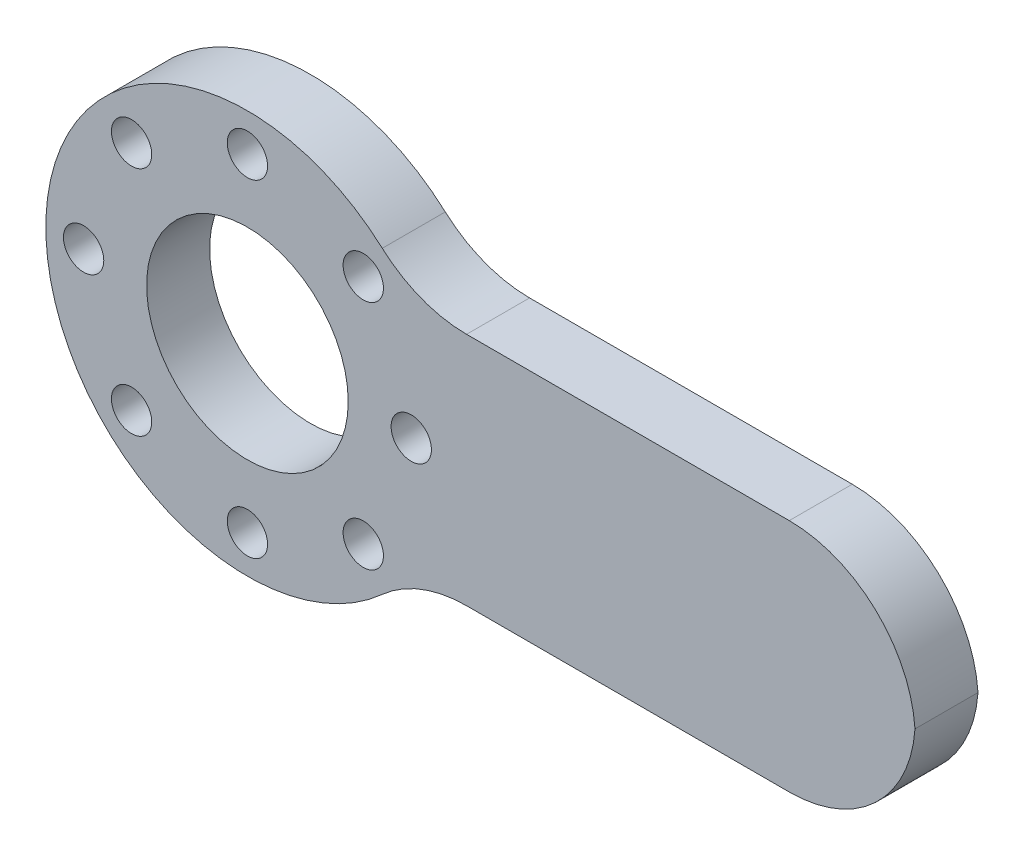
ISO-10303-21;
HEADER;
FILE_DESCRIPTION(('STEP AP214'),'2;1');
FILE_NAME('part.step','',(''),(''),'','','');
FILE_SCHEMA(('AUTOMOTIVE_DESIGN { 1 0 10303 214 1 1 1 1 }'));
ENDSEC;
DATA;
#1=APPLICATION_CONTEXT('core data for automotive mechanical design processes');
#2=APPLICATION_PROTOCOL_DEFINITION('international standard','automotive_design',2000,#1);
#3=PRODUCT_CONTEXT('',#1,'mechanical');
#4=PRODUCT('Part','Part','',(#3));
#5=PRODUCT_RELATED_PRODUCT_CATEGORY('part','',(#4));
#6=PRODUCT_DEFINITION_FORMATION('','',#4);
#7=PRODUCT_DEFINITION_CONTEXT('part definition',#1,'design');
#8=PRODUCT_DEFINITION('design','',#6,#7);
#9=PRODUCT_DEFINITION_SHAPE('','',#8);
#10=(LENGTH_UNIT() NAMED_UNIT(*) SI_UNIT(.MILLI.,.METRE.));
#11=(NAMED_UNIT(*) PLANE_ANGLE_UNIT() SI_UNIT($,.RADIAN.));
#12=(NAMED_UNIT(*) SI_UNIT($,.STERADIAN.) SOLID_ANGLE_UNIT());
#13=UNCERTAINTY_MEASURE_WITH_UNIT(LENGTH_MEASURE(1.E-05),#10,'distance_accuracy_value','');
#14=(GEOMETRIC_REPRESENTATION_CONTEXT(3) GLOBAL_UNCERTAINTY_ASSIGNED_CONTEXT((#13)) GLOBAL_UNIT_ASSIGNED_CONTEXT((#10,
#11,#12)) REPRESENTATION_CONTEXT('',''));
#15=CARTESIAN_POINT('',(0.,0.,0.));
#16=DIRECTION('',(0.,0.,1.));
#17=DIRECTION('',(1.,0.,0.));
#18=AXIS2_PLACEMENT_3D('',#15,#16,#17);
#19=CARTESIAN_POINT('',(0.,0.,5.));
#20=DIRECTION('',(0.,0.,1.));
#21=DIRECTION('',(1.,0.,0.));
#22=AXIS2_PLACEMENT_3D('',#19,#20,#21);
#23=PLANE('',#22);
#24=CARTESIAN_POINT('',(-9.19238815542526,9.19238815542508,5.));
#25=DIRECTION('',(0.,0.,1.));
#26=DIRECTION('',(1.,0.,0.));
#27=AXIS2_PLACEMENT_3D('',#24,#25,#26);
#28=CIRCLE('',#27,1.60000000000038);
#29=CARTESIAN_POINT('',(-7.59238815542487,9.19238815542508,5.));
#30=VERTEX_POINT('',#29);
#31=EDGE_CURVE('E208',#30,#30,#28,.T.);
#32=ORIENTED_EDGE('',*,*,#31,.F.);
#33=EDGE_LOOP('',(#32));
#34=FACE_BOUND('',#33,.T.);
#35=CARTESIAN_POINT('',(-9.19238815542512,-9.19238815542511,5.));
#36=DIRECTION('',(0.,0.,1.));
#37=DIRECTION('',(1.,0.,0.));
#38=AXIS2_PLACEMENT_3D('',#35,#36,#37);
#39=CIRCLE('',#38,1.60000000000024);
#40=CARTESIAN_POINT('',(-7.59238815542488,-9.19238815542511,5.));
#41=VERTEX_POINT('',#40);
#42=EDGE_CURVE('E196',#41,#41,#39,.T.);
#43=ORIENTED_EDGE('',*,*,#42,.F.);
#44=EDGE_LOOP('',(#43));
#45=FACE_BOUND('',#44,.T.);
#46=CARTESIAN_POINT('',(9.19238815542511,-9.19238815542512,5.));
#47=DIRECTION('',(0.,0.,1.));
#48=DIRECTION('',(1.,0.,0.));
#49=AXIS2_PLACEMENT_3D('',#46,#47,#48);
#50=CIRCLE('',#49,1.6000000000002);
#51=CARTESIAN_POINT('',(10.7923881554253,-9.19238815542512,5.));
#52=VERTEX_POINT('',#51);
#53=EDGE_CURVE('E184',#52,#52,#50,.T.);
#54=ORIENTED_EDGE('',*,*,#53,.F.);
#55=EDGE_LOOP('',(#54));
#56=FACE_BOUND('',#55,.T.);
#57=CARTESIAN_POINT('',(9.19238815542524,9.192388155425,5.));
#58=DIRECTION('',(0.,0.,1.));
#59=DIRECTION('',(1.,0.,0.));
#60=AXIS2_PLACEMENT_3D('',#57,#58,#59);
#61=CIRCLE('',#60,1.6);
#62=CARTESIAN_POINT('',(10.7923881554252,9.192388155425,5.));
#63=VERTEX_POINT('',#62);
#64=EDGE_CURVE('E173',#63,#63,#61,.T.);
#65=ORIENTED_EDGE('',*,*,#64,.F.);
#66=EDGE_LOOP('',(#65));
#67=FACE_BOUND('',#66,.T.);
#68=CARTESIAN_POINT('',(0.,0.,5.));
#69=DIRECTION('',(0.,0.,1.));
#70=DIRECTION('',(1.,0.,0.));
#71=AXIS2_PLACEMENT_3D('',#68,#69,#70);
#72=CIRCLE('',#71,16.);
#73=CARTESIAN_POINT('',(10.702251826327,11.8937717249777,5.));
#74=VERTEX_POINT('',#73);
#75=CARTESIAN_POINT('',(10.702251826327,-11.8937717249777,5.));
#76=VERTEX_POINT('',#75);
#77=EDGE_CURVE('E111',#74,#76,#72,.T.);
#78=ORIENTED_EDGE('',*,*,#77,.T.);
#79=CARTESIAN_POINT('',(17.3911592177814,-19.3273790530888,5.));
#80=DIRECTION('',(0.,0.,1.));
#81=DIRECTION('',(1.,0.,0.));
#82=AXIS2_PLACEMENT_3D('',#79,#80,#81);
#83=CIRCLE('',#82,10.);
#84=CARTESIAN_POINT('',(17.3911592177814,-9.32737905308882,5.));
#85=VERTEX_POINT('',#84);
#86=EDGE_CURVE('E143',#76,#85,#83,.F.);
#87=ORIENTED_EDGE('',*,*,#86,.T.);
#88=DIRECTION('',(1.,0.,0.));
#89=VECTOR('',#88,1.);
#90=CARTESIAN_POINT('',(13.,-9.32737905308882,5.));
#91=LINE('',#90,#89);
#92=CARTESIAN_POINT('',(43.,-9.32737905308882,5.));
#93=VERTEX_POINT('',#92);
#94=EDGE_CURVE('E122',#85,#93,#91,.T.);
#95=ORIENTED_EDGE('',*,*,#94,.T.);
#96=CARTESIAN_POINT('',(43.,0.672620946911182,5.));
#97=DIRECTION('',(0.,0.,1.));
#98=DIRECTION('',(1.,0.,0.));
#99=AXIS2_PLACEMENT_3D('',#96,#97,#98);
#100=CIRCLE('',#99,10.);
#101=CARTESIAN_POINT('',(52.9773534096862,0.,5.));
#102=VERTEX_POINT('',#101);
#103=EDGE_CURVE('E104',#93,#102,#100,.T.);
#104=ORIENTED_EDGE('',*,*,#103,.T.);
#105=CARTESIAN_POINT('',(43.,-0.672620946911185,5.));
#106=DIRECTION('',(0.,0.,1.));
#107=DIRECTION('',(1.,0.,0.));
#108=AXIS2_PLACEMENT_3D('',#105,#106,#107);
#109=CIRCLE('',#108,10.);
#110=CARTESIAN_POINT('',(43.,9.32737905308882,5.));
#111=VERTEX_POINT('',#110);
#112=EDGE_CURVE('E128',#102,#111,#109,.T.);
#113=ORIENTED_EDGE('',*,*,#112,.T.);
#114=DIRECTION('',(-1.,0.,0.));
#115=VECTOR('',#114,1.);
#116=CARTESIAN_POINT('',(13.,9.32737905308881,5.));
#117=LINE('',#116,#115);
#118=CARTESIAN_POINT('',(17.3911592177814,9.32737905308881,5.));
#119=VERTEX_POINT('',#118);
#120=EDGE_CURVE('E99',#111,#119,#117,.T.);
#121=ORIENTED_EDGE('',*,*,#120,.T.);
#122=CARTESIAN_POINT('',(17.3911592177814,19.3273790530888,5.));
#123=DIRECTION('',(0.,0.,1.));
#124=DIRECTION('',(1.,0.,0.));
#125=AXIS2_PLACEMENT_3D('',#122,#123,#124);
#126=CIRCLE('',#125,10.);
#127=EDGE_CURVE('E11',#119,#74,#126,.F.);
#128=ORIENTED_EDGE('',*,*,#127,.T.);
#129=EDGE_LOOP('',(#78,#87,#95,#104,#113,#121,#128));
#130=FACE_BOUND('',#129,.T.);
#131=CARTESIAN_POINT('',(1.47039768258712E-13,13.,5.));
#132=DIRECTION('',(0.,0.,1.));
#133=DIRECTION('',(1.,0.,0.));
#134=AXIS2_PLACEMENT_3D('',#131,#132,#133);
#135=CIRCLE('',#134,1.6);
#136=CARTESIAN_POINT('',(1.60000000000015,13.,5.));
#137=VERTEX_POINT('',#136);
#138=EDGE_CURVE('E165',#137,#137,#135,.T.);
#139=ORIENTED_EDGE('',*,*,#138,.F.);
#140=EDGE_LOOP('',(#139));
#141=FACE_BOUND('',#140,.T.);
#142=CARTESIAN_POINT('',(13.,1.45740069793345E-13,5.));
#143=DIRECTION('',(0.,0.,1.));
#144=DIRECTION('',(1.,0.,0.));
#145=AXIS2_PLACEMENT_3D('',#142,#143,#144);
#146=CIRCLE('',#145,1.60000000000032);
#147=CARTESIAN_POINT('',(14.6000000000003,1.45740069793345E-13,5.));
#148=VERTEX_POINT('',#147);
#149=EDGE_CURVE('E178',#148,#148,#146,.T.);
#150=ORIENTED_EDGE('',*,*,#149,.F.);
#151=EDGE_LOOP('',(#150));
#152=FACE_BOUND('',#151,.T.);
#153=CARTESIAN_POINT('',(0.,-13.,5.));
#154=DIRECTION('',(0.,0.,1.));
#155=DIRECTION('',(1.,0.,0.));
#156=AXIS2_PLACEMENT_3D('',#153,#154,#155);
#157=CIRCLE('',#156,1.60000000000022);
#158=CARTESIAN_POINT('',(1.60000000000021,-13.,5.));
#159=VERTEX_POINT('',#158);
#160=EDGE_CURVE('E190',#159,#159,#157,.T.);
#161=ORIENTED_EDGE('',*,*,#160,.F.);
#162=EDGE_LOOP('',(#161));
#163=FACE_BOUND('',#162,.T.);
#164=CARTESIAN_POINT('',(-13.0000000000002,-1.48923622721049E-13,5.));
#165=DIRECTION('',(0.,0.,1.));
#166=DIRECTION('',(1.,0.,0.));
#167=AXIS2_PLACEMENT_3D('',#164,#165,#166);
#168=CIRCLE('',#167,1.60000000000034);
#169=CARTESIAN_POINT('',(-11.3999999999999,-1.48923622721049E-13,5.));
#170=VERTEX_POINT('',#169);
#171=EDGE_CURVE('E202',#170,#170,#168,.T.);
#172=ORIENTED_EDGE('',*,*,#171,.F.);
#173=EDGE_LOOP('',(#172));
#174=FACE_BOUND('',#173,.T.);
#175=CARTESIAN_POINT('',(0.,0.,5.));
#176=DIRECTION('',(0.,0.,1.));
#177=DIRECTION('',(1.,0.,0.));
#178=AXIS2_PLACEMENT_3D('',#175,#176,#177);
#179=CIRCLE('',#178,8.);
#180=CARTESIAN_POINT('',(8.,0.,5.));
#181=VERTEX_POINT('',#180);
#182=EDGE_CURVE('E214',#181,#181,#179,.T.);
#183=ORIENTED_EDGE('',*,*,#182,.F.);
#184=EDGE_LOOP('',(#183));
#185=FACE_BOUND('',#184,.T.);
#186=ADVANCED_FACE('F39',(#34,#45,#56,#67,#130,#141,#152,#163,#174,#185),#23,.T.);
#187=CARTESIAN_POINT('',(0.,0.,0.));
#188=DIRECTION('',(0.,0.,1.));
#189=DIRECTION('',(1.,0.,0.));
#190=AXIS2_PLACEMENT_3D('',#187,#188,#189);
#191=PLANE('',#190);
#192=CARTESIAN_POINT('',(43.,-0.672620946911185,0.));
#193=DIRECTION('',(0.,0.,1.));
#194=DIRECTION('',(1.,0.,0.));
#195=AXIS2_PLACEMENT_3D('',#192,#193,#194);
#196=CIRCLE('',#195,10.);
#197=CARTESIAN_POINT('',(43.,9.32737905308882,0.));
#198=VERTEX_POINT('',#197);
#199=CARTESIAN_POINT('',(52.9773534096862,0.,0.));
#200=VERTEX_POINT('',#199);
#201=EDGE_CURVE('E109',#198,#200,#196,.F.);
#202=ORIENTED_EDGE('',*,*,#201,.T.);
#203=CARTESIAN_POINT('',(43.,0.672620946911182,0.));
#204=DIRECTION('',(0.,0.,1.));
#205=DIRECTION('',(1.,0.,0.));
#206=AXIS2_PLACEMENT_3D('',#203,#204,#205);
#207=CIRCLE('',#206,10.);
#208=CARTESIAN_POINT('',(43.,-9.32737905308882,0.));
#209=VERTEX_POINT('',#208);
#210=EDGE_CURVE('E118',#200,#209,#207,.F.);
#211=ORIENTED_EDGE('',*,*,#210,.T.);
#212=DIRECTION('',(1.,0.,0.));
#213=VECTOR('',#212,1.);
#214=CARTESIAN_POINT('',(13.,-9.32737905308882,0.));
#215=LINE('',#214,#213);
#216=CARTESIAN_POINT('',(17.3911592177814,-9.32737905308882,0.));
#217=VERTEX_POINT('',#216);
#218=EDGE_CURVE('E112',#217,#209,#215,.T.);
#219=ORIENTED_EDGE('',*,*,#218,.F.);
#220=CARTESIAN_POINT('',(17.3911592177814,-19.3273790530888,0.));
#221=DIRECTION('',(0.,0.,1.));
#222=DIRECTION('',(1.,0.,0.));
#223=AXIS2_PLACEMENT_3D('',#220,#221,#222);
#224=CIRCLE('',#223,10.);
#225=CARTESIAN_POINT('',(10.702251826327,-11.8937717249777,0.));
#226=VERTEX_POINT('',#225);
#227=EDGE_CURVE('E141',#217,#226,#224,.T.);
#228=ORIENTED_EDGE('',*,*,#227,.T.);
#229=CARTESIAN_POINT('',(0.,0.,0.));
#230=DIRECTION('',(0.,0.,1.));
#231=DIRECTION('',(1.,0.,0.));
#232=AXIS2_PLACEMENT_3D('',#229,#230,#231);
#233=CIRCLE('',#232,16.);
#234=CARTESIAN_POINT('',(10.702251826327,11.8937717249777,0.));
#235=VERTEX_POINT('',#234);
#236=EDGE_CURVE('E161',#235,#226,#233,.T.);
#237=ORIENTED_EDGE('',*,*,#236,.F.);
#238=CARTESIAN_POINT('',(17.3911592177814,19.3273790530888,0.));
#239=DIRECTION('',(0.,0.,1.));
#240=DIRECTION('',(1.,0.,0.));
#241=AXIS2_PLACEMENT_3D('',#238,#239,#240);
#242=CIRCLE('',#241,10.);
#243=CARTESIAN_POINT('',(17.3911592177814,9.32737905308881,0.));
#244=VERTEX_POINT('',#243);
#245=EDGE_CURVE('E47',#235,#244,#242,.T.);
#246=ORIENTED_EDGE('',*,*,#245,.T.);
#247=DIRECTION('',(-1.,0.,0.));
#248=VECTOR('',#247,1.);
#249=CARTESIAN_POINT('',(13.,9.32737905308881,0.));
#250=LINE('',#249,#248);
#251=EDGE_CURVE('E98',#198,#244,#250,.T.);
#252=ORIENTED_EDGE('',*,*,#251,.F.);
#253=EDGE_LOOP('',(#202,#211,#219,#228,#237,#246,#252));
#254=FACE_BOUND('',#253,.T.);
#255=CARTESIAN_POINT('',(1.47039768258712E-13,13.,0.));
#256=DIRECTION('',(0.,0.,1.));
#257=DIRECTION('',(1.,0.,0.));
#258=AXIS2_PLACEMENT_3D('',#255,#256,#257);
#259=CIRCLE('',#258,1.6);
#260=CARTESIAN_POINT('',(1.60000000000015,13.,0.));
#261=VERTEX_POINT('',#260);
#262=EDGE_CURVE('E168',#261,#261,#259,.T.);
#263=ORIENTED_EDGE('',*,*,#262,.T.);
#264=EDGE_LOOP('',(#263));
#265=FACE_BOUND('',#264,.T.);
#266=CARTESIAN_POINT('',(9.19238815542524,9.192388155425,0.));
#267=DIRECTION('',(0.,0.,1.));
#268=DIRECTION('',(1.,0.,0.));
#269=AXIS2_PLACEMENT_3D('',#266,#267,#268);
#270=CIRCLE('',#269,1.6);
#271=CARTESIAN_POINT('',(10.7923881554252,9.192388155425,0.));
#272=VERTEX_POINT('',#271);
#273=EDGE_CURVE('E175',#272,#272,#270,.T.);
#274=ORIENTED_EDGE('',*,*,#273,.T.);
#275=EDGE_LOOP('',(#274));
#276=FACE_BOUND('',#275,.T.);
#277=CARTESIAN_POINT('',(13.,1.45740069793345E-13,0.));
#278=DIRECTION('',(0.,0.,1.));
#279=DIRECTION('',(1.,0.,0.));
#280=AXIS2_PLACEMENT_3D('',#277,#278,#279);
#281=CIRCLE('',#280,1.60000000000032);
#282=CARTESIAN_POINT('',(14.6000000000003,1.45740069793345E-13,0.));
#283=VERTEX_POINT('',#282);
#284=EDGE_CURVE('E181',#283,#283,#281,.T.);
#285=ORIENTED_EDGE('',*,*,#284,.T.);
#286=EDGE_LOOP('',(#285));
#287=FACE_BOUND('',#286,.T.);
#288=CARTESIAN_POINT('',(9.19238815542511,-9.19238815542512,0.));
#289=DIRECTION('',(0.,0.,1.));
#290=DIRECTION('',(1.,0.,0.));
#291=AXIS2_PLACEMENT_3D('',#288,#289,#290);
#292=CIRCLE('',#291,1.6000000000002);
#293=CARTESIAN_POINT('',(10.7923881554253,-9.19238815542512,0.));
#294=VERTEX_POINT('',#293);
#295=EDGE_CURVE('E187',#294,#294,#292,.T.);
#296=ORIENTED_EDGE('',*,*,#295,.T.);
#297=EDGE_LOOP('',(#296));
#298=FACE_BOUND('',#297,.T.);
#299=CARTESIAN_POINT('',(0.,-13.,0.));
#300=DIRECTION('',(0.,0.,1.));
#301=DIRECTION('',(1.,0.,0.));
#302=AXIS2_PLACEMENT_3D('',#299,#300,#301);
#303=CIRCLE('',#302,1.60000000000022);
#304=CARTESIAN_POINT('',(1.60000000000021,-13.,0.));
#305=VERTEX_POINT('',#304);
#306=EDGE_CURVE('E193',#305,#305,#303,.T.);
#307=ORIENTED_EDGE('',*,*,#306,.T.);
#308=EDGE_LOOP('',(#307));
#309=FACE_BOUND('',#308,.T.);
#310=CARTESIAN_POINT('',(-9.19238815542512,-9.19238815542511,0.));
#311=DIRECTION('',(0.,0.,1.));
#312=DIRECTION('',(1.,0.,0.));
#313=AXIS2_PLACEMENT_3D('',#310,#311,#312);
#314=CIRCLE('',#313,1.60000000000024);
#315=CARTESIAN_POINT('',(-7.59238815542488,-9.19238815542511,0.));
#316=VERTEX_POINT('',#315);
#317=EDGE_CURVE('E199',#316,#316,#314,.T.);
#318=ORIENTED_EDGE('',*,*,#317,.T.);
#319=EDGE_LOOP('',(#318));
#320=FACE_BOUND('',#319,.T.);
#321=CARTESIAN_POINT('',(-13.0000000000002,-1.48923622721049E-13,0.));
#322=DIRECTION('',(0.,0.,1.));
#323=DIRECTION('',(1.,0.,0.));
#324=AXIS2_PLACEMENT_3D('',#321,#322,#323);
#325=CIRCLE('',#324,1.60000000000034);
#326=CARTESIAN_POINT('',(-11.3999999999999,-1.48923622721049E-13,0.));
#327=VERTEX_POINT('',#326);
#328=EDGE_CURVE('E205',#327,#327,#325,.T.);
#329=ORIENTED_EDGE('',*,*,#328,.T.);
#330=EDGE_LOOP('',(#329));
#331=FACE_BOUND('',#330,.T.);
#332=CARTESIAN_POINT('',(-9.19238815542526,9.19238815542508,0.));
#333=DIRECTION('',(0.,0.,1.));
#334=DIRECTION('',(1.,0.,0.));
#335=AXIS2_PLACEMENT_3D('',#332,#333,#334);
#336=CIRCLE('',#335,1.60000000000038);
#337=CARTESIAN_POINT('',(-7.59238815542487,9.19238815542508,0.));
#338=VERTEX_POINT('',#337);
#339=EDGE_CURVE('E211',#338,#338,#336,.T.);
#340=ORIENTED_EDGE('',*,*,#339,.T.);
#341=EDGE_LOOP('',(#340));
#342=FACE_BOUND('',#341,.T.);
#343=CARTESIAN_POINT('',(0.,0.,0.));
#344=DIRECTION('',(0.,0.,1.));
#345=DIRECTION('',(1.,0.,0.));
#346=AXIS2_PLACEMENT_3D('',#343,#344,#345);
#347=CIRCLE('',#346,8.);
#348=CARTESIAN_POINT('',(8.,0.,0.));
#349=VERTEX_POINT('',#348);
#350=EDGE_CURVE('E132',#349,#349,#347,.T.);
#351=ORIENTED_EDGE('',*,*,#350,.T.);
#352=EDGE_LOOP('',(#351));
#353=FACE_BOUND('',#352,.T.);
#354=ADVANCED_FACE('F106',(#254,#265,#276,#287,#298,#309,#320,#331,#342,#353),#191,.F.);
#355=CARTESIAN_POINT('',(0.,0.,5.));
#356=DIRECTION('',(0.,0.,-1.));
#357=DIRECTION('',(-1.,0.,0.));
#358=AXIS2_PLACEMENT_3D('',#355,#356,#357);
#359=CYLINDRICAL_SURFACE('',#358,16.);
#360=ORIENTED_EDGE('',*,*,#236,.T.);
#361=DIRECTION('',(0.,0.,-1.));
#362=VECTOR('',#361,1.);
#363=CARTESIAN_POINT('',(10.702251826327,-11.8937717249777,5.));
#364=LINE('',#363,#362);
#365=EDGE_CURVE('E138',#226,#76,#364,.F.);
#366=ORIENTED_EDGE('',*,*,#365,.T.);
#367=ORIENTED_EDGE('',*,*,#77,.F.);
#368=DIRECTION('',(0.,0.,-1.));
#369=VECTOR('',#368,1.);
#370=CARTESIAN_POINT('',(10.702251826327,11.8937717249777,5.));
#371=LINE('',#370,#369);
#372=EDGE_CURVE('E135',#74,#235,#371,.T.);
#373=ORIENTED_EDGE('',*,*,#372,.T.);
#374=EDGE_LOOP('',(#360,#366,#367,#373));
#375=FACE_BOUND('',#374,.T.);
#376=ADVANCED_FACE('F163',(#375),#359,.T.);
#377=CARTESIAN_POINT('',(13.,-9.32737905308882,5.));
#378=DIRECTION('',(0.,1.,0.));
#379=DIRECTION('',(0.,0.,1.));
#380=AXIS2_PLACEMENT_3D('',#377,#378,#379);
#381=PLANE('',#380);
#382=ORIENTED_EDGE('',*,*,#94,.F.);
#383=DIRECTION('',(0.,0.,1.));
#384=VECTOR('',#383,1.);
#385=CARTESIAN_POINT('',(17.3911592177814,-9.32737905308882,0.));
#386=LINE('',#385,#384);
#387=EDGE_CURVE('E103',#85,#217,#386,.F.);
#388=ORIENTED_EDGE('',*,*,#387,.T.);
#389=ORIENTED_EDGE('',*,*,#218,.T.);
#390=DIRECTION('',(0.,0.,-1.));
#391=VECTOR('',#390,1.);
#392=CARTESIAN_POINT('',(43.,-9.32737905308882,5.));
#393=LINE('',#392,#391);
#394=EDGE_CURVE('E120',#209,#93,#393,.F.);
#395=ORIENTED_EDGE('',*,*,#394,.T.);
#396=EDGE_LOOP('',(#382,#388,#389,#395));
#397=FACE_BOUND('',#396,.T.);
#398=ADVANCED_FACE('F155',(#397),#381,.F.);
#399=CARTESIAN_POINT('',(13.,9.32737905308881,5.));
#400=DIRECTION('',(0.,-1.,0.));
#401=DIRECTION('',(1.,0.,0.));
#402=AXIS2_PLACEMENT_3D('',#399,#400,#401);
#403=PLANE('',#402);
#404=ORIENTED_EDGE('',*,*,#251,.T.);
#405=DIRECTION('',(0.,0.,1.));
#406=VECTOR('',#405,1.);
#407=CARTESIAN_POINT('',(17.3911592177814,9.32737905308881,5.));
#408=LINE('',#407,#406);
#409=EDGE_CURVE('E60',#244,#119,#408,.T.);
#410=ORIENTED_EDGE('',*,*,#409,.T.);
#411=ORIENTED_EDGE('',*,*,#120,.F.);
#412=DIRECTION('',(0.,0.,-1.));
#413=VECTOR('',#412,1.);
#414=CARTESIAN_POINT('',(43.,9.32737905308882,5.));
#415=LINE('',#414,#413);
#416=EDGE_CURVE('E96',#111,#198,#415,.T.);
#417=ORIENTED_EDGE('',*,*,#416,.T.);
#418=EDGE_LOOP('',(#404,#410,#411,#417));
#419=FACE_BOUND('',#418,.T.);
#420=ADVANCED_FACE('F97',(#419),#403,.F.);
#421=CARTESIAN_POINT('',(1.47039768258712E-13,13.,5.));
#422=DIRECTION('',(0.,0.,-1.));
#423=DIRECTION('',(-1.,0.,0.));
#424=AXIS2_PLACEMENT_3D('',#421,#422,#423);
#425=CYLINDRICAL_SURFACE('',#424,1.6);
#426=ORIENTED_EDGE('',*,*,#138,.T.);
#427=EDGE_LOOP('',(#426));
#428=FACE_BOUND('',#427,.T.);
#429=ORIENTED_EDGE('',*,*,#262,.F.);
#430=EDGE_LOOP('',(#429));
#431=FACE_BOUND('',#430,.T.);
#432=ADVANCED_FACE('F236',(#428,#431),#425,.F.);
#433=CARTESIAN_POINT('',(9.19238815542524,9.192388155425,5.));
#434=DIRECTION('',(0.,0.,-1.));
#435=DIRECTION('',(-1.,0.,0.));
#436=AXIS2_PLACEMENT_3D('',#433,#434,#435);
#437=CYLINDRICAL_SURFACE('',#436,1.6);
#438=ORIENTED_EDGE('',*,*,#64,.T.);
#439=EDGE_LOOP('',(#438));
#440=FACE_BOUND('',#439,.T.);
#441=ORIENTED_EDGE('',*,*,#273,.F.);
#442=EDGE_LOOP('',(#441));
#443=FACE_BOUND('',#442,.T.);
#444=ADVANCED_FACE('F342',(#440,#443),#437,.F.);
#445=CARTESIAN_POINT('',(13.,1.45740069793345E-13,5.));
#446=DIRECTION('',(0.,0.,-1.));
#447=DIRECTION('',(-1.,0.,0.));
#448=AXIS2_PLACEMENT_3D('',#445,#446,#447);
#449=CYLINDRICAL_SURFACE('',#448,1.60000000000032);
#450=ORIENTED_EDGE('',*,*,#149,.T.);
#451=EDGE_LOOP('',(#450));
#452=FACE_BOUND('',#451,.T.);
#453=ORIENTED_EDGE('',*,*,#284,.F.);
#454=EDGE_LOOP('',(#453));
#455=FACE_BOUND('',#454,.T.);
#456=ADVANCED_FACE('F332',(#452,#455),#449,.F.);
#457=CARTESIAN_POINT('',(9.19238815542511,-9.19238815542512,5.));
#458=DIRECTION('',(0.,0.,-1.));
#459=DIRECTION('',(-1.,0.,0.));
#460=AXIS2_PLACEMENT_3D('',#457,#458,#459);
#461=CYLINDRICAL_SURFACE('',#460,1.6000000000002);
#462=ORIENTED_EDGE('',*,*,#53,.T.);
#463=EDGE_LOOP('',(#462));
#464=FACE_BOUND('',#463,.T.);
#465=ORIENTED_EDGE('',*,*,#295,.F.);
#466=EDGE_LOOP('',(#465));
#467=FACE_BOUND('',#466,.T.);
#468=ADVANCED_FACE('F322',(#464,#467),#461,.F.);
#469=CARTESIAN_POINT('',(0.,-13.,5.));
#470=DIRECTION('',(0.,0.,-1.));
#471=DIRECTION('',(-1.,0.,0.));
#472=AXIS2_PLACEMENT_3D('',#469,#470,#471);
#473=CYLINDRICAL_SURFACE('',#472,1.60000000000022);
#474=ORIENTED_EDGE('',*,*,#160,.T.);
#475=EDGE_LOOP('',(#474));
#476=FACE_BOUND('',#475,.T.);
#477=ORIENTED_EDGE('',*,*,#306,.F.);
#478=EDGE_LOOP('',(#477));
#479=FACE_BOUND('',#478,.T.);
#480=ADVANCED_FACE('F312',(#476,#479),#473,.F.);
#481=CARTESIAN_POINT('',(-9.19238815542512,-9.19238815542511,5.));
#482=DIRECTION('',(0.,0.,-1.));
#483=DIRECTION('',(-1.,0.,0.));
#484=AXIS2_PLACEMENT_3D('',#481,#482,#483);
#485=CYLINDRICAL_SURFACE('',#484,1.60000000000024);
#486=ORIENTED_EDGE('',*,*,#42,.T.);
#487=EDGE_LOOP('',(#486));
#488=FACE_BOUND('',#487,.T.);
#489=ORIENTED_EDGE('',*,*,#317,.F.);
#490=EDGE_LOOP('',(#489));
#491=FACE_BOUND('',#490,.T.);
#492=ADVANCED_FACE('F302',(#488,#491),#485,.F.);
#493=CARTESIAN_POINT('',(-13.0000000000002,-1.48923622721049E-13,5.));
#494=DIRECTION('',(0.,0.,-1.));
#495=DIRECTION('',(-1.,0.,0.));
#496=AXIS2_PLACEMENT_3D('',#493,#494,#495);
#497=CYLINDRICAL_SURFACE('',#496,1.60000000000034);
#498=ORIENTED_EDGE('',*,*,#171,.T.);
#499=EDGE_LOOP('',(#498));
#500=FACE_BOUND('',#499,.T.);
#501=ORIENTED_EDGE('',*,*,#328,.F.);
#502=EDGE_LOOP('',(#501));
#503=FACE_BOUND('',#502,.T.);
#504=ADVANCED_FACE('F292',(#500,#503),#497,.F.);
#505=CARTESIAN_POINT('',(-9.19238815542526,9.19238815542508,5.));
#506=DIRECTION('',(0.,0.,-1.));
#507=DIRECTION('',(-1.,0.,0.));
#508=AXIS2_PLACEMENT_3D('',#505,#506,#507);
#509=CYLINDRICAL_SURFACE('',#508,1.60000000000038);
#510=ORIENTED_EDGE('',*,*,#31,.T.);
#511=EDGE_LOOP('',(#510));
#512=FACE_BOUND('',#511,.T.);
#513=ORIENTED_EDGE('',*,*,#339,.F.);
#514=EDGE_LOOP('',(#513));
#515=FACE_BOUND('',#514,.T.);
#516=ADVANCED_FACE('F283',(#512,#515),#509,.F.);
#517=CARTESIAN_POINT('',(0.,0.,5.));
#518=DIRECTION('',(0.,0.,-1.));
#519=DIRECTION('',(-1.,0.,0.));
#520=AXIS2_PLACEMENT_3D('',#517,#518,#519);
#521=CYLINDRICAL_SURFACE('',#520,8.);
#522=ORIENTED_EDGE('',*,*,#182,.T.);
#523=EDGE_LOOP('',(#522));
#524=FACE_BOUND('',#523,.T.);
#525=ORIENTED_EDGE('',*,*,#350,.F.);
#526=EDGE_LOOP('',(#525));
#527=FACE_BOUND('',#526,.T.);
#528=ADVANCED_FACE('F222',(#524,#527),#521,.F.);
#529=CARTESIAN_POINT('',(43.,-0.672620946911185,5.));
#530=DIRECTION('',(0.,0.,-1.));
#531=DIRECTION('',(-1.,0.,0.));
#532=AXIS2_PLACEMENT_3D('',#529,#530,#531);
#533=CYLINDRICAL_SURFACE('',#532,10.);
#534=ORIENTED_EDGE('',*,*,#416,.F.);
#535=ORIENTED_EDGE('',*,*,#112,.F.);
#536=DIRECTION('',(0.,0.,-1.));
#537=VECTOR('',#536,1.);
#538=CARTESIAN_POINT('',(52.9773534096862,0.,2.5));
#539=LINE('',#538,#537);
#540=EDGE_CURVE('E116',#200,#102,#539,.F.);
#541=ORIENTED_EDGE('',*,*,#540,.F.);
#542=ORIENTED_EDGE('',*,*,#201,.F.);
#543=EDGE_LOOP('',(#534,#535,#541,#542));
#544=FACE_BOUND('',#543,.T.);
#545=ADVANCED_FACE('F114',(#544),#533,.T.);
#546=CARTESIAN_POINT('',(43.,0.672620946911182,5.));
#547=DIRECTION('',(0.,0.,-1.));
#548=DIRECTION('',(-1.,0.,0.));
#549=AXIS2_PLACEMENT_3D('',#546,#547,#548);
#550=CYLINDRICAL_SURFACE('',#549,10.);
#551=ORIENTED_EDGE('',*,*,#103,.F.);
#552=ORIENTED_EDGE('',*,*,#394,.F.);
#553=ORIENTED_EDGE('',*,*,#210,.F.);
#554=ORIENTED_EDGE('',*,*,#540,.T.);
#555=EDGE_LOOP('',(#551,#552,#553,#554));
#556=FACE_BOUND('',#555,.T.);
#557=ADVANCED_FACE('F245',(#556),#550,.T.);
#558=CARTESIAN_POINT('',(17.3911592177814,-19.3273790530888,5.));
#559=DIRECTION('',(0.,0.,-1.));
#560=DIRECTION('',(-1.,0.,0.));
#561=AXIS2_PLACEMENT_3D('',#558,#559,#560);
#562=CYLINDRICAL_SURFACE('',#561,10.);
#563=ORIENTED_EDGE('',*,*,#86,.F.);
#564=ORIENTED_EDGE('',*,*,#365,.F.);
#565=ORIENTED_EDGE('',*,*,#227,.F.);
#566=ORIENTED_EDGE('',*,*,#387,.F.);
#567=EDGE_LOOP('',(#563,#564,#565,#566));
#568=FACE_BOUND('',#567,.T.);
#569=ADVANCED_FACE('F159',(#568),#562,.F.);
#570=CARTESIAN_POINT('',(17.3911592177814,19.3273790530888,5.));
#571=DIRECTION('',(0.,0.,-1.));
#572=DIRECTION('',(-1.,0.,0.));
#573=AXIS2_PLACEMENT_3D('',#570,#571,#572);
#574=CYLINDRICAL_SURFACE('',#573,10.);
#575=ORIENTED_EDGE('',*,*,#127,.F.);
#576=ORIENTED_EDGE('',*,*,#409,.F.);
#577=ORIENTED_EDGE('',*,*,#245,.F.);
#578=ORIENTED_EDGE('',*,*,#372,.F.);
#579=EDGE_LOOP('',(#575,#576,#577,#578));
#580=FACE_BOUND('',#579,.T.);
#581=ADVANCED_FACE('F41',(#580),#574,.F.);
#582=CLOSED_SHELL('',(#186,#354,#376,#398,#420,#432,#444,#456,#468,#480,#492,#504,#516,#528,
#545,#557,#569,#581));
#583=MANIFOLD_SOLID_BREP('B2',#582);
#584=ADVANCED_BREP_SHAPE_REPRESENTATION('',(#18,#583),#14);
#585=SHAPE_DEFINITION_REPRESENTATION(#9,#584);
ENDSEC;
END-ISO-10303-21;
